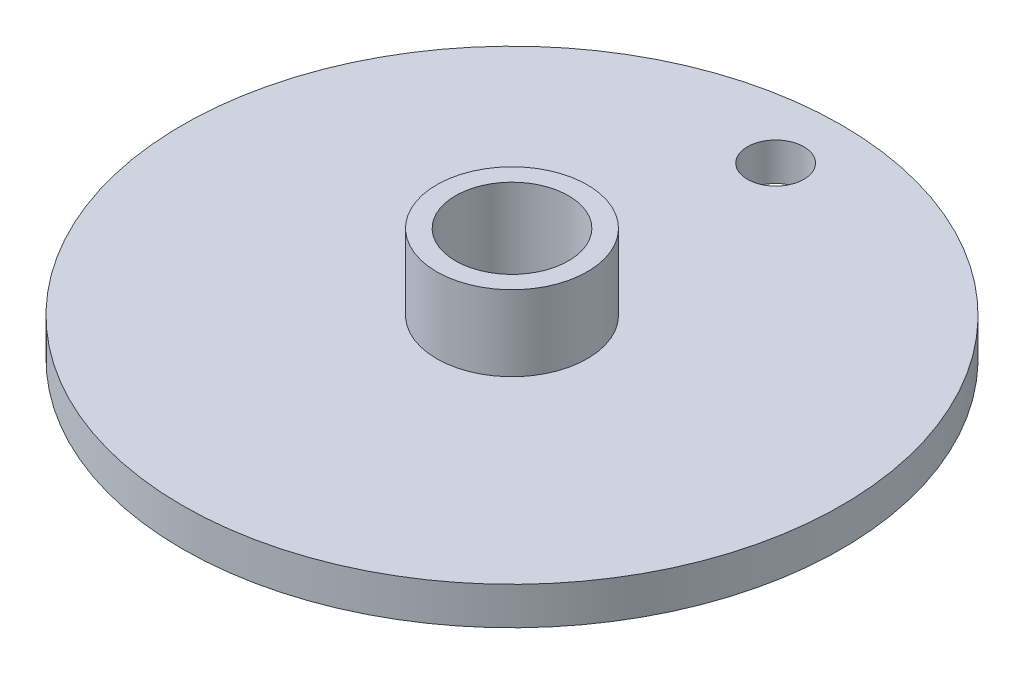
ISO-10303-21;
HEADER;
FILE_DESCRIPTION(('STEP AP214'),'2;1');
FILE_NAME('part.step','',(''),(''),'','','');
FILE_SCHEMA(('AUTOMOTIVE_DESIGN { 1 0 10303 214 1 1 1 1 }'));
ENDSEC;
DATA;
#1=APPLICATION_CONTEXT('core data for automotive mechanical design processes');
#2=APPLICATION_PROTOCOL_DEFINITION('international standard','automotive_design',2000,#1);
#3=PRODUCT_CONTEXT('',#1,'mechanical');
#4=PRODUCT('Part','Part','',(#3));
#5=PRODUCT_RELATED_PRODUCT_CATEGORY('part','',(#4));
#6=PRODUCT_DEFINITION_FORMATION('','',#4);
#7=PRODUCT_DEFINITION_CONTEXT('part definition',#1,'design');
#8=PRODUCT_DEFINITION('design','',#6,#7);
#9=PRODUCT_DEFINITION_SHAPE('','',#8);
#10=(LENGTH_UNIT() NAMED_UNIT(*) SI_UNIT(.MILLI.,.METRE.));
#11=(NAMED_UNIT(*) PLANE_ANGLE_UNIT() SI_UNIT($,.RADIAN.));
#12=(NAMED_UNIT(*) SI_UNIT($,.STERADIAN.) SOLID_ANGLE_UNIT());
#13=UNCERTAINTY_MEASURE_WITH_UNIT(LENGTH_MEASURE(1.E-05),#10,'distance_accuracy_value','');
#14=(GEOMETRIC_REPRESENTATION_CONTEXT(3) GLOBAL_UNCERTAINTY_ASSIGNED_CONTEXT((#13)) GLOBAL_UNIT_ASSIGNED_CONTEXT((#10,
#11,#12)) REPRESENTATION_CONTEXT('',''));
#15=CARTESIAN_POINT('',(0.,0.,0.));
#16=DIRECTION('',(0.,0.,1.));
#17=DIRECTION('',(1.,0.,0.));
#18=AXIS2_PLACEMENT_3D('',#15,#16,#17);
#19=CARTESIAN_POINT('',(0.,2.,0.));
#20=DIRECTION('',(0.,1.,0.));
#21=DIRECTION('',(0.,0.,1.));
#22=AXIS2_PLACEMENT_3D('',#19,#20,#21);
#23=PLANE('',#22);
#24=CARTESIAN_POINT('',(0.,2.,-14.));
#25=DIRECTION('',(0.,1.,0.));
#26=DIRECTION('',(0.,0.,1.));
#27=AXIS2_PLACEMENT_3D('',#24,#25,#26);
#28=CIRCLE('',#27,1.50000000000001);
#29=CARTESIAN_POINT('',(0.,2.,-15.5));
#30=VERTEX_POINT('',#29);
#31=EDGE_CURVE('E56',#30,#30,#28,.F.);
#32=ORIENTED_EDGE('',*,*,#31,.T.);
#33=EDGE_LOOP('',(#32));
#34=FACE_BOUND('',#33,.T.);
#35=CARTESIAN_POINT('',(0.,2.,0.));
#36=DIRECTION('',(0.,1.,0.));
#37=DIRECTION('',(0.,0.,1.));
#38=AXIS2_PLACEMENT_3D('',#35,#36,#37);
#39=CIRCLE('',#38,17.5);
#40=CARTESIAN_POINT('',(0.,2.,17.5));
#41=VERTEX_POINT('',#40);
#42=EDGE_CURVE('E10',#41,#41,#39,.T.);
#43=ORIENTED_EDGE('',*,*,#42,.T.);
#44=EDGE_LOOP('',(#43));
#45=FACE_BOUND('',#44,.T.);
#46=CARTESIAN_POINT('',(0.,2.,0.));
#47=DIRECTION('',(0.,1.,0.));
#48=DIRECTION('',(0.,0.,1.));
#49=AXIS2_PLACEMENT_3D('',#46,#47,#48);
#50=CIRCLE('',#49,4.);
#51=CARTESIAN_POINT('',(0.,2.,4.));
#52=VERTEX_POINT('',#51);
#53=EDGE_CURVE('E47',#52,#52,#50,.T.);
#54=ORIENTED_EDGE('',*,*,#53,.F.);
#55=EDGE_LOOP('',(#54));
#56=FACE_BOUND('',#55,.T.);
#57=ADVANCED_FACE('F31',(#34,#45,#56),#23,.T.);
#58=CARTESIAN_POINT('',(0.,0.,0.));
#59=DIRECTION('',(0.,1.,0.));
#60=DIRECTION('',(0.,0.,1.));
#61=AXIS2_PLACEMENT_3D('',#58,#59,#60);
#62=PLANE('',#61);
#63=CARTESIAN_POINT('',(0.,0.,-14.));
#64=DIRECTION('',(0.,-1.,0.));
#65=DIRECTION('',(0.,0.,-1.));
#66=AXIS2_PLACEMENT_3D('',#63,#64,#65);
#67=CIRCLE('',#66,1.50000000000001);
#68=CARTESIAN_POINT('',(0.,0.,-15.5));
#69=VERTEX_POINT('',#68);
#70=EDGE_CURVE('E55',#69,#69,#67,.T.);
#71=ORIENTED_EDGE('',*,*,#70,.F.);
#72=EDGE_LOOP('',(#71));
#73=FACE_BOUND('',#72,.T.);
#74=CARTESIAN_POINT('',(0.,0.,0.));
#75=DIRECTION('',(0.,1.,0.));
#76=DIRECTION('',(0.,0.,1.));
#77=AXIS2_PLACEMENT_3D('',#74,#75,#76);
#78=CIRCLE('',#77,17.5);
#79=CARTESIAN_POINT('',(0.,0.,17.5));
#80=VERTEX_POINT('',#79);
#81=EDGE_CURVE('E35',#80,#80,#78,.T.);
#82=ORIENTED_EDGE('',*,*,#81,.F.);
#83=EDGE_LOOP('',(#82));
#84=FACE_BOUND('',#83,.T.);
#85=CARTESIAN_POINT('',(0.,0.,0.));
#86=DIRECTION('',(0.,1.,0.));
#87=DIRECTION('',(0.,0.,1.));
#88=AXIS2_PLACEMENT_3D('',#85,#86,#87);
#89=CIRCLE('',#88,3.);
#90=CARTESIAN_POINT('',(0.,0.,3.));
#91=VERTEX_POINT('',#90);
#92=EDGE_CURVE('E42',#91,#91,#89,.T.);
#93=ORIENTED_EDGE('',*,*,#92,.T.);
#94=EDGE_LOOP('',(#93));
#95=FACE_BOUND('',#94,.T.);
#96=ADVANCED_FACE('F64',(#73,#84,#95),#62,.F.);
#97=CARTESIAN_POINT('',(0.,2.,0.));
#98=DIRECTION('',(0.,-1.,0.));
#99=DIRECTION('',(0.,0.,-1.));
#100=AXIS2_PLACEMENT_3D('',#97,#98,#99);
#101=CYLINDRICAL_SURFACE('',#100,17.5);
#102=ORIENTED_EDGE('',*,*,#42,.F.);
#103=EDGE_LOOP('',(#102));
#104=FACE_BOUND('',#103,.T.);
#105=ORIENTED_EDGE('',*,*,#81,.T.);
#106=EDGE_LOOP('',(#105));
#107=FACE_BOUND('',#106,.T.);
#108=ADVANCED_FACE('F33',(#104,#107),#101,.T.);
#109=CARTESIAN_POINT('',(0.,2.,0.));
#110=DIRECTION('',(0.,-1.,0.));
#111=DIRECTION('',(0.,0.,-1.));
#112=AXIS2_PLACEMENT_3D('',#109,#110,#111);
#113=CYLINDRICAL_SURFACE('',#112,3.);
#114=ORIENTED_EDGE('',*,*,#92,.F.);
#115=EDGE_LOOP('',(#114));
#116=FACE_BOUND('',#115,.T.);
#117=CARTESIAN_POINT('',(0.,6.,0.));
#118=DIRECTION('',(0.,1.,0.));
#119=DIRECTION('',(0.,0.,1.));
#120=AXIS2_PLACEMENT_3D('',#117,#118,#119);
#121=CIRCLE('',#120,3.);
#122=CARTESIAN_POINT('',(0.,6.,3.));
#123=VERTEX_POINT('',#122);
#124=EDGE_CURVE('E50',#123,#123,#121,.T.);
#125=ORIENTED_EDGE('',*,*,#124,.T.);
#126=EDGE_LOOP('',(#125));
#127=FACE_BOUND('',#126,.T.);
#128=ADVANCED_FACE('F71',(#116,#127),#113,.F.);
#129=CARTESIAN_POINT('',(0.,6.,0.));
#130=DIRECTION('',(0.,1.,0.));
#131=DIRECTION('',(0.,0.,1.));
#132=AXIS2_PLACEMENT_3D('',#129,#130,#131);
#133=PLANE('',#132);
#134=CARTESIAN_POINT('',(0.,6.,0.));
#135=DIRECTION('',(0.,1.,0.));
#136=DIRECTION('',(0.,0.,1.));
#137=AXIS2_PLACEMENT_3D('',#134,#135,#136);
#138=CIRCLE('',#137,4.);
#139=CARTESIAN_POINT('',(0.,6.,4.));
#140=VERTEX_POINT('',#139);
#141=EDGE_CURVE('E46',#140,#140,#138,.T.);
#142=ORIENTED_EDGE('',*,*,#141,.T.);
#143=EDGE_LOOP('',(#142));
#144=FACE_BOUND('',#143,.T.);
#145=ORIENTED_EDGE('',*,*,#124,.F.);
#146=EDGE_LOOP('',(#145));
#147=FACE_BOUND('',#146,.T.);
#148=ADVANCED_FACE('F74',(#144,#147),#133,.T.);
#149=CARTESIAN_POINT('',(0.,6.,0.));
#150=DIRECTION('',(0.,-1.,0.));
#151=DIRECTION('',(0.,0.,-1.));
#152=AXIS2_PLACEMENT_3D('',#149,#150,#151);
#153=CYLINDRICAL_SURFACE('',#152,4.);
#154=ORIENTED_EDGE('',*,*,#141,.F.);
#155=EDGE_LOOP('',(#154));
#156=FACE_BOUND('',#155,.T.);
#157=ORIENTED_EDGE('',*,*,#53,.T.);
#158=EDGE_LOOP('',(#157));
#159=FACE_BOUND('',#158,.T.);
#160=ADVANCED_FACE('F79',(#156,#159),#153,.T.);
#161=CARTESIAN_POINT('',(0.,6.001,-14.));
#162=DIRECTION('',(0.,-1.,0.));
#163=DIRECTION('',(0.,0.,-1.));
#164=AXIS2_PLACEMENT_3D('',#161,#162,#163);
#165=CYLINDRICAL_SURFACE('',#164,1.50000000000001);
#166=CARTESIAN_POINT('',(0.,2.,-15.5));
#167=CARTESIAN_POINT('',(0.,1.97916666666667,-15.5));
#168=CARTESIAN_POINT('',(0.,1.95833333333333,-15.5));
#169=CARTESIAN_POINT('',(0.,1.91666666666667,-15.5));
#170=CARTESIAN_POINT('',(0.,1.89583333333333,-15.5));
#171=CARTESIAN_POINT('',(0.,1.85416666666667,-15.5));
#172=CARTESIAN_POINT('',(0.,1.83333333333333,-15.5));
#173=CARTESIAN_POINT('',(0.,1.79166666666667,-15.5));
#174=CARTESIAN_POINT('',(0.,1.77083333333333,-15.5));
#175=CARTESIAN_POINT('',(0.,1.72916666666667,-15.5));
#176=CARTESIAN_POINT('',(0.,1.70833333333333,-15.5));
#177=CARTESIAN_POINT('',(0.,1.66666666666667,-15.5));
#178=CARTESIAN_POINT('',(0.,1.64583333333333,-15.5));
#179=CARTESIAN_POINT('',(0.,1.60416666666667,-15.5));
#180=CARTESIAN_POINT('',(0.,1.58333333333333,-15.5));
#181=CARTESIAN_POINT('',(0.,1.54166666666667,-15.5));
#182=CARTESIAN_POINT('',(0.,1.52083333333333,-15.5));
#183=CARTESIAN_POINT('',(0.,1.47916666666667,-15.5));
#184=CARTESIAN_POINT('',(0.,1.45833333333333,-15.5));
#185=CARTESIAN_POINT('',(0.,1.41666666666667,-15.5));
#186=CARTESIAN_POINT('',(0.,1.39583333333333,-15.5));
#187=CARTESIAN_POINT('',(0.,1.35416666666667,-15.5));
#188=CARTESIAN_POINT('',(0.,1.33333333333333,-15.5));
#189=CARTESIAN_POINT('',(0.,1.29166666666667,-15.5));
#190=CARTESIAN_POINT('',(0.,1.27083333333333,-15.5));
#191=CARTESIAN_POINT('',(0.,1.22916666666667,-15.5));
#192=CARTESIAN_POINT('',(0.,1.20833333333333,-15.5));
#193=CARTESIAN_POINT('',(0.,1.16666666666667,-15.5));
#194=CARTESIAN_POINT('',(0.,1.14583333333333,-15.5));
#195=CARTESIAN_POINT('',(0.,1.10416666666667,-15.5));
#196=CARTESIAN_POINT('',(0.,1.08333333333333,-15.5));
#197=CARTESIAN_POINT('',(0.,1.04166666666667,-15.5));
#198=CARTESIAN_POINT('',(0.,1.02083333333333,-15.5));
#199=CARTESIAN_POINT('',(0.,0.979166666666667,-15.5));
#200=CARTESIAN_POINT('',(0.,0.958333333333333,-15.5));
#201=CARTESIAN_POINT('',(0.,0.916666666666667,-15.5));
#202=CARTESIAN_POINT('',(0.,0.895833333333333,-15.5));
#203=CARTESIAN_POINT('',(0.,0.854166666666667,-15.5));
#204=CARTESIAN_POINT('',(0.,0.833333333333333,-15.5));
#205=CARTESIAN_POINT('',(0.,0.791666666666667,-15.5));
#206=CARTESIAN_POINT('',(0.,0.770833333333333,-15.5));
#207=CARTESIAN_POINT('',(0.,0.729166666666667,-15.5));
#208=CARTESIAN_POINT('',(0.,0.708333333333333,-15.5));
#209=CARTESIAN_POINT('',(0.,0.666666666666667,-15.5));
#210=CARTESIAN_POINT('',(0.,0.645833333333334,-15.5));
#211=CARTESIAN_POINT('',(0.,0.604166666666667,-15.5));
#212=CARTESIAN_POINT('',(0.,0.583333333333334,-15.5));
#213=CARTESIAN_POINT('',(0.,0.541666666666667,-15.5));
#214=CARTESIAN_POINT('',(0.,0.520833333333334,-15.5));
#215=CARTESIAN_POINT('',(0.,0.479166666666667,-15.5));
#216=CARTESIAN_POINT('',(0.,0.458333333333334,-15.5));
#217=CARTESIAN_POINT('',(0.,0.416666666666667,-15.5));
#218=CARTESIAN_POINT('',(0.,0.395833333333334,-15.5));
#219=CARTESIAN_POINT('',(0.,0.354166666666667,-15.5));
#220=CARTESIAN_POINT('',(0.,0.333333333333334,-15.5));
#221=CARTESIAN_POINT('',(0.,0.291666666666667,-15.5));
#222=CARTESIAN_POINT('',(0.,0.270833333333334,-15.5));
#223=CARTESIAN_POINT('',(0.,0.229166666666667,-15.5));
#224=CARTESIAN_POINT('',(0.,0.208333333333334,-15.5));
#225=CARTESIAN_POINT('',(0.,0.166666666666667,-15.5));
#226=CARTESIAN_POINT('',(0.,0.145833333333333,-15.5));
#227=CARTESIAN_POINT('',(0.,0.104166666666667,-15.5));
#228=CARTESIAN_POINT('',(0.,0.0833333333333334,-15.5));
#229=CARTESIAN_POINT('',(0.,0.0416666666666667,-15.5));
#230=CARTESIAN_POINT('',(0.,0.0208333333333333,-15.5));
#231=CARTESIAN_POINT('',(0.,0.,-15.5));
#232=B_SPLINE_CURVE_WITH_KNOTS('',3,(#166,#167,#168,#169,#170,#171,#172,#173,#174,#175,#176,
#177,#178,#179,#180,#181,#182,#183,#184,#185,#186,#187,#188,#189,#190,#191,#192,#193,#194,#195,
#196,#197,#198,#199,#200,#201,#202,#203,#204,#205,#206,#207,#208,#209,#210,#211,#212,#213,#214,
#215,#216,#217,#218,#219,#220,#221,#222,#223,#224,#225,#226,#227,#228,#229,#230,#231),
.UNSPECIFIED.,.F.,.F.,(4,2,2,2,2,2,2,2,2,2,2,2,2,2,2,2,2,2,2,2,2,2,2,2,2,2,2,2,2,2,2,2,4),(0.,
0.0625000000000001,0.125,0.1875,0.25,0.3125,0.375,0.4375,0.5,0.5625,0.625,0.6875,0.75,0.8125,
0.875,0.9375,1.,1.0625,1.125,1.1875,1.25,1.3125,1.375,1.4375,1.5,1.5625,1.625,1.6875,1.75,
1.8125,1.875,1.9375,2.),.UNSPECIFIED.);
#233=EDGE_CURVE('BSEAM62',#30,#69,#232,.T.);
#234=ORIENTED_EDGE('',*,*,#31,.F.);
#235=ORIENTED_EDGE('',*,*,#70,.T.);
#236=ORIENTED_EDGE('',*,*,#233,.T.);
#237=ORIENTED_EDGE('',*,*,#233,.F.);
#238=EDGE_LOOP('',(#234,#236,#235,#237));
#239=FACE_BOUND('',#238,.T.);
#240=ADVANCED_FACE('F62',(#239),#165,.F.);
#241=CLOSED_SHELL('',(#57,#96,#108,#128,#148,#160,#240));
#242=MANIFOLD_SOLID_BREP('B2',#241);
#243=ADVANCED_BREP_SHAPE_REPRESENTATION('',(#18,#242),#14);
#244=SHAPE_DEFINITION_REPRESENTATION(#9,#243);
ENDSEC;
END-ISO-10303-21;
